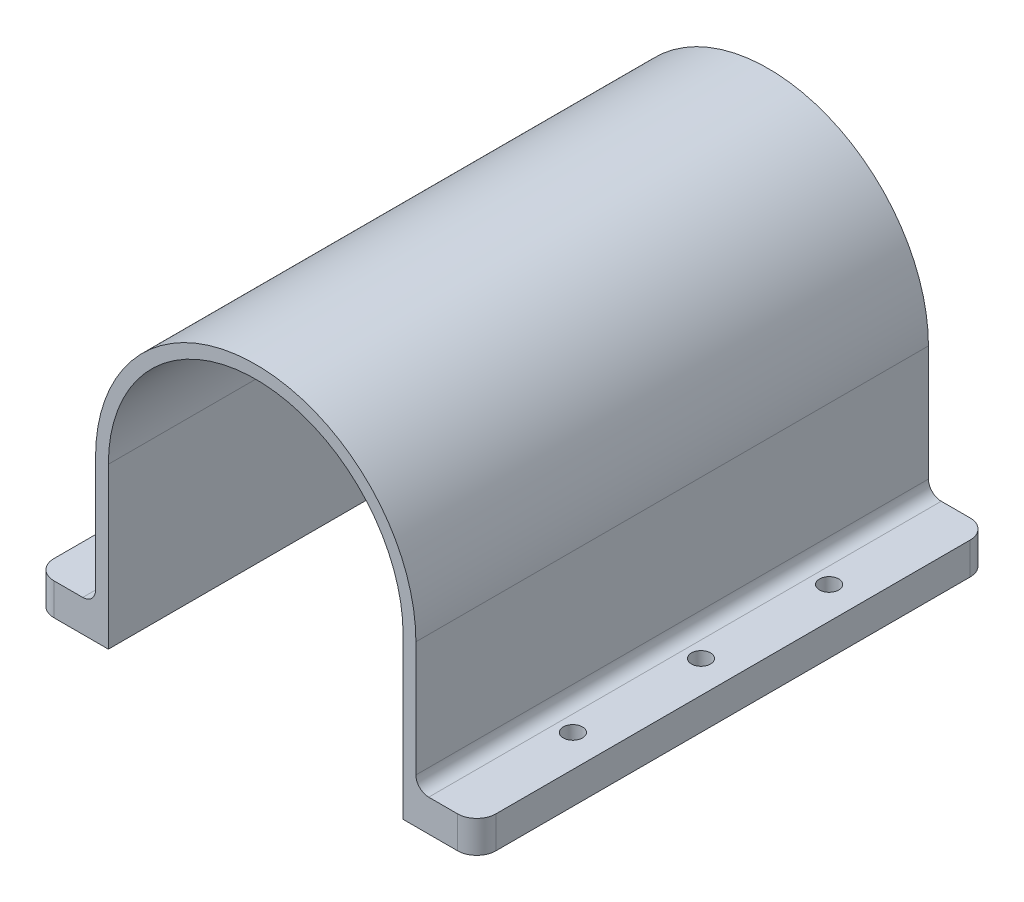
ISO-10303-21;
HEADER;
FILE_DESCRIPTION(('STEP AP214'),'2;1');
FILE_NAME('part.step','',(''),(''),'','','');
FILE_SCHEMA(('AUTOMOTIVE_DESIGN { 1 0 10303 214 1 1 1 1 }'));
ENDSEC;
DATA;
#1=APPLICATION_CONTEXT('core data for automotive mechanical design processes');
#2=APPLICATION_PROTOCOL_DEFINITION('international standard','automotive_design',2000,#1);
#3=PRODUCT_CONTEXT('',#1,'mechanical');
#4=PRODUCT('Part','Part','',(#3));
#5=PRODUCT_RELATED_PRODUCT_CATEGORY('part','',(#4));
#6=PRODUCT_DEFINITION_FORMATION('','',#4);
#7=PRODUCT_DEFINITION_CONTEXT('part definition',#1,'design');
#8=PRODUCT_DEFINITION('design','',#6,#7);
#9=PRODUCT_DEFINITION_SHAPE('','',#8);
#10=(LENGTH_UNIT() NAMED_UNIT(*) SI_UNIT(.MILLI.,.METRE.));
#11=(NAMED_UNIT(*) PLANE_ANGLE_UNIT() SI_UNIT($,.RADIAN.));
#12=(NAMED_UNIT(*) SI_UNIT($,.STERADIAN.) SOLID_ANGLE_UNIT());
#13=UNCERTAINTY_MEASURE_WITH_UNIT(LENGTH_MEASURE(1.E-05),#10,'distance_accuracy_value','');
#14=(GEOMETRIC_REPRESENTATION_CONTEXT(3) GLOBAL_UNCERTAINTY_ASSIGNED_CONTEXT((#13)) GLOBAL_UNIT_ASSIGNED_CONTEXT((#10,
#11,#12)) REPRESENTATION_CONTEXT('',''));
#15=CARTESIAN_POINT('',(0.,0.,0.));
#16=DIRECTION('',(0.,0.,1.));
#17=DIRECTION('',(1.,0.,0.));
#18=AXIS2_PLACEMENT_3D('',#15,#16,#17);
#19=CARTESIAN_POINT('',(-12.4097240098239,12.4097240098239,80.));
#20=DIRECTION('',(0.,0.,-1.));
#21=DIRECTION('',(-1.,0.,0.));
#22=AXIS2_PLACEMENT_3D('',#19,#20,#21);
#23=CYLINDRICAL_SURFACE('',#22,2.);
#24=CARTESIAN_POINT('',(-12.4097240098239,12.4097240098239,0.));
#25=DIRECTION('',(0.,0.,1.));
#26=DIRECTION('',(1.,0.,0.));
#27=AXIS2_PLACEMENT_3D('',#24,#25,#26);
#28=CIRCLE('',#27,2.);
#29=CARTESIAN_POINT('',(-10.4097240098239,12.4097240098239,0.));
#30=VERTEX_POINT('',#29);
#31=EDGE_CURVE('E231',#30,#30,#28,.T.);
#32=ORIENTED_EDGE('',*,*,#31,.F.);
#33=EDGE_LOOP('',(#32));
#34=FACE_BOUND('',#33,.T.);
#35=CARTESIAN_POINT('',(-12.4097240098239,12.4097240098239,5.));
#36=DIRECTION('',(0.,0.,1.));
#37=DIRECTION('',(1.,0.,0.));
#38=AXIS2_PLACEMENT_3D('',#35,#36,#37);
#39=CIRCLE('',#38,2.);
#40=CARTESIAN_POINT('',(-10.4097240098239,12.4097240098239,5.));
#41=VERTEX_POINT('',#40);
#42=EDGE_CURVE('E216',#41,#41,#39,.T.);
#43=ORIENTED_EDGE('',*,*,#42,.T.);
#44=EDGE_LOOP('',(#43));
#45=FACE_BOUND('',#44,.T.);
#46=ADVANCED_FACE('F39',(#34,#45),#23,.F.);
#47=CARTESIAN_POINT('',(0.,0.,80.));
#48=DIRECTION('',(0.,0.,-1.));
#49=DIRECTION('',(-1.,0.,0.));
#50=AXIS2_PLACEMENT_3D('',#47,#48,#49);
#51=CYLINDRICAL_SURFACE('',#50,13.);
#52=CARTESIAN_POINT('',(0.,0.,0.));
#53=DIRECTION('',(0.,0.,1.));
#54=DIRECTION('',(1.,0.,0.));
#55=AXIS2_PLACEMENT_3D('',#52,#53,#54);
#56=CIRCLE('',#55,13.);
#57=CARTESIAN_POINT('',(13.,0.,0.));
#58=VERTEX_POINT('',#57);
#59=EDGE_CURVE('E228',#58,#58,#56,.T.);
#60=ORIENTED_EDGE('',*,*,#59,.F.);
#61=EDGE_LOOP('',(#60));
#62=FACE_BOUND('',#61,.T.);
#63=CARTESIAN_POINT('',(0.,0.,5.));
#64=DIRECTION('',(0.,0.,1.));
#65=DIRECTION('',(1.,0.,0.));
#66=AXIS2_PLACEMENT_3D('',#63,#64,#65);
#67=CIRCLE('',#66,13.);
#68=CARTESIAN_POINT('',(13.,0.,5.));
#69=VERTEX_POINT('',#68);
#70=EDGE_CURVE('E213',#69,#69,#67,.T.);
#71=ORIENTED_EDGE('',*,*,#70,.T.);
#72=EDGE_LOOP('',(#71));
#73=FACE_BOUND('',#72,.T.);
#74=ADVANCED_FACE('F400',(#62,#73),#51,.F.);
#75=CARTESIAN_POINT('',(12.4097240098239,12.4097240098239,80.));
#76=DIRECTION('',(0.,0.,-1.));
#77=DIRECTION('',(-1.,0.,0.));
#78=AXIS2_PLACEMENT_3D('',#75,#76,#77);
#79=CYLINDRICAL_SURFACE('',#78,2.);
#80=CARTESIAN_POINT('',(12.4097240098239,12.4097240098239,0.));
#81=DIRECTION('',(0.,0.,1.));
#82=DIRECTION('',(1.,0.,0.));
#83=AXIS2_PLACEMENT_3D('',#80,#81,#82);
#84=CIRCLE('',#83,2.);
#85=CARTESIAN_POINT('',(14.4097240098239,12.4097240098239,0.));
#86=VERTEX_POINT('',#85);
#87=EDGE_CURVE('E225',#86,#86,#84,.T.);
#88=ORIENTED_EDGE('',*,*,#87,.F.);
#89=EDGE_LOOP('',(#88));
#90=FACE_BOUND('',#89,.T.);
#91=CARTESIAN_POINT('',(12.4097240098239,12.4097240098239,5.));
#92=DIRECTION('',(0.,0.,1.));
#93=DIRECTION('',(1.,0.,0.));
#94=AXIS2_PLACEMENT_3D('',#91,#92,#93);
#95=CIRCLE('',#94,2.);
#96=CARTESIAN_POINT('',(14.4097240098239,12.4097240098239,5.));
#97=VERTEX_POINT('',#96);
#98=EDGE_CURVE('E210',#97,#97,#95,.T.);
#99=ORIENTED_EDGE('',*,*,#98,.T.);
#100=EDGE_LOOP('',(#99));
#101=FACE_BOUND('',#100,.T.);
#102=ADVANCED_FACE('F407',(#90,#101),#79,.F.);
#103=CARTESIAN_POINT('',(12.4097240098239,-12.4097240098239,80.));
#104=DIRECTION('',(0.,0.,-1.));
#105=DIRECTION('',(-1.,0.,0.));
#106=AXIS2_PLACEMENT_3D('',#103,#104,#105);
#107=CYLINDRICAL_SURFACE('',#106,2.);
#108=CARTESIAN_POINT('',(12.4097240098239,-12.4097240098239,0.));
#109=DIRECTION('',(0.,0.,1.));
#110=DIRECTION('',(1.,0.,0.));
#111=AXIS2_PLACEMENT_3D('',#108,#109,#110);
#112=CIRCLE('',#111,2.);
#113=CARTESIAN_POINT('',(14.4097240098239,-12.4097240098239,0.));
#114=VERTEX_POINT('',#113);
#115=EDGE_CURVE('E222',#114,#114,#112,.T.);
#116=ORIENTED_EDGE('',*,*,#115,.F.);
#117=EDGE_LOOP('',(#116));
#118=FACE_BOUND('',#117,.T.);
#119=CARTESIAN_POINT('',(12.4097240098239,-12.4097240098239,5.));
#120=DIRECTION('',(0.,0.,1.));
#121=DIRECTION('',(1.,0.,0.));
#122=AXIS2_PLACEMENT_3D('',#119,#120,#121);
#123=CIRCLE('',#122,2.);
#124=CARTESIAN_POINT('',(14.4097240098239,-12.4097240098239,5.));
#125=VERTEX_POINT('',#124);
#126=EDGE_CURVE('E207',#125,#125,#123,.T.);
#127=ORIENTED_EDGE('',*,*,#126,.T.);
#128=EDGE_LOOP('',(#127));
#129=FACE_BOUND('',#128,.T.);
#130=ADVANCED_FACE('F592',(#118,#129),#107,.F.);
#131=CARTESIAN_POINT('',(-12.4097240098239,-12.4097240098239,80.));
#132=DIRECTION('',(0.,0.,-1.));
#133=DIRECTION('',(-1.,0.,0.));
#134=AXIS2_PLACEMENT_3D('',#131,#132,#133);
#135=CYLINDRICAL_SURFACE('',#134,2.);
#136=CARTESIAN_POINT('',(-12.4097240098239,-12.4097240098239,0.));
#137=DIRECTION('',(0.,0.,1.));
#138=DIRECTION('',(1.,0.,0.));
#139=AXIS2_PLACEMENT_3D('',#136,#137,#138);
#140=CIRCLE('',#139,2.);
#141=CARTESIAN_POINT('',(-10.4097240098239,-12.4097240098239,0.));
#142=VERTEX_POINT('',#141);
#143=EDGE_CURVE('E219',#142,#142,#140,.T.);
#144=ORIENTED_EDGE('',*,*,#143,.F.);
#145=EDGE_LOOP('',(#144));
#146=FACE_BOUND('',#145,.T.);
#147=CARTESIAN_POINT('',(-12.4097240098239,-12.4097240098239,5.));
#148=DIRECTION('',(0.,0.,1.));
#149=DIRECTION('',(1.,0.,0.));
#150=AXIS2_PLACEMENT_3D('',#147,#148,#149);
#151=CIRCLE('',#150,2.);
#152=CARTESIAN_POINT('',(-10.4097240098239,-12.4097240098239,5.));
#153=VERTEX_POINT('',#152);
#154=EDGE_CURVE('E203',#153,#153,#151,.T.);
#155=ORIENTED_EDGE('',*,*,#154,.T.);
#156=EDGE_LOOP('',(#155));
#157=FACE_BOUND('',#156,.T.);
#158=ADVANCED_FACE('F416',(#146,#157),#135,.F.);
#159=CARTESIAN_POINT('',(0.,0.,80.));
#160=DIRECTION('',(0.,0.,1.));
#161=DIRECTION('',(1.,0.,0.));
#162=AXIS2_PLACEMENT_3D('',#159,#160,#161);
#163=PLANE('',#162);
#164=DIRECTION('',(1.,0.,0.));
#165=VECTOR('',#164,1.);
#166=CARTESIAN_POINT('',(-34.5,-25.,80.));
#167=LINE('',#166,#165);
#168=CARTESIAN_POINT('',(23.,-25.,80.));
#169=VERTEX_POINT('',#168);
#170=CARTESIAN_POINT('',(31.5,-25.,80.));
#171=VERTEX_POINT('',#170);
#172=EDGE_CURVE('E245',#169,#171,#167,.T.);
#173=ORIENTED_EDGE('',*,*,#172,.T.);
#174=DIRECTION('',(0.,1.,0.));
#175=VECTOR('',#174,1.);
#176=CARTESIAN_POINT('',(31.5,-20.,80.));
#177=LINE('',#176,#175);
#178=CARTESIAN_POINT('',(31.5,-20.,80.));
#179=VERTEX_POINT('',#178);
#180=EDGE_CURVE('E318',#171,#179,#177,.T.);
#181=ORIENTED_EDGE('',*,*,#180,.T.);
#182=DIRECTION('',(-1.,0.,0.));
#183=VECTOR('',#182,1.);
#184=CARTESIAN_POINT('',(25.,-20.,80.));
#185=LINE('',#184,#183);
#186=CARTESIAN_POINT('',(27.,-20.,80.));
#187=VERTEX_POINT('',#186);
#188=EDGE_CURVE('E248',#179,#187,#185,.T.);
#189=ORIENTED_EDGE('',*,*,#188,.T.);
#190=CARTESIAN_POINT('',(27.,-18.,80.));
#191=DIRECTION('',(0.,0.,1.));
#192=DIRECTION('',(1.,0.,0.));
#193=AXIS2_PLACEMENT_3D('',#190,#191,#192);
#194=CIRCLE('',#193,2.);
#195=CARTESIAN_POINT('',(25.,-18.,80.));
#196=VERTEX_POINT('',#195);
#197=EDGE_CURVE('E309',#187,#196,#194,.F.);
#198=ORIENTED_EDGE('',*,*,#197,.T.);
#199=DIRECTION('',(0.,1.,0.));
#200=VECTOR('',#199,1.);
#201=CARTESIAN_POINT('',(25.,0.,80.));
#202=LINE('',#201,#200);
#203=CARTESIAN_POINT('',(25.,0.,80.));
#204=VERTEX_POINT('',#203);
#205=EDGE_CURVE('E250',#196,#204,#202,.T.);
#206=ORIENTED_EDGE('',*,*,#205,.T.);
#207=CARTESIAN_POINT('',(0.,0.,80.));
#208=DIRECTION('',(0.,0.,1.));
#209=DIRECTION('',(1.,0.,0.));
#210=AXIS2_PLACEMENT_3D('',#207,#208,#209);
#211=CIRCLE('',#210,25.);
#212=CARTESIAN_POINT('',(-25.,0.,80.));
#213=VERTEX_POINT('',#212);
#214=EDGE_CURVE('E235',#204,#213,#211,.T.);
#215=ORIENTED_EDGE('',*,*,#214,.T.);
#216=DIRECTION('',(0.,-1.,0.));
#217=VECTOR('',#216,1.);
#218=CARTESIAN_POINT('',(-25.,0.,80.));
#219=LINE('',#218,#217);
#220=CARTESIAN_POINT('',(-25.,-18.,80.));
#221=VERTEX_POINT('',#220);
#222=EDGE_CURVE('E238',#213,#221,#219,.T.);
#223=ORIENTED_EDGE('',*,*,#222,.T.);
#224=CARTESIAN_POINT('',(-27.,-18.,80.));
#225=DIRECTION('',(0.,0.,1.));
#226=DIRECTION('',(1.,0.,0.));
#227=AXIS2_PLACEMENT_3D('',#224,#225,#226);
#228=CIRCLE('',#227,2.);
#229=CARTESIAN_POINT('',(-27.,-20.,80.));
#230=VERTEX_POINT('',#229);
#231=EDGE_CURVE('E313',#221,#230,#228,.F.);
#232=ORIENTED_EDGE('',*,*,#231,.T.);
#233=DIRECTION('',(-1.,0.,0.));
#234=VECTOR('',#233,1.);
#235=CARTESIAN_POINT('',(-25.,-20.,80.));
#236=LINE('',#235,#234);
#237=CARTESIAN_POINT('',(-31.5,-20.,80.));
#238=VERTEX_POINT('',#237);
#239=EDGE_CURVE('E242',#230,#238,#236,.T.);
#240=ORIENTED_EDGE('',*,*,#239,.T.);
#241=DIRECTION('',(0.,-1.,0.));
#242=VECTOR('',#241,1.);
#243=CARTESIAN_POINT('',(-31.5,-25.,80.));
#244=LINE('',#243,#242);
#245=CARTESIAN_POINT('',(-31.5,-25.,80.));
#246=VERTEX_POINT('',#245);
#247=EDGE_CURVE('E315',#238,#246,#244,.T.);
#248=ORIENTED_EDGE('',*,*,#247,.T.);
#249=CARTESIAN_POINT('',(-23.,-25.,80.));
#250=VERTEX_POINT('',#249);
#251=EDGE_CURVE('E246',#246,#250,#167,.T.);
#252=ORIENTED_EDGE('',*,*,#251,.T.);
#253=DIRECTION('',(0.,-1.,0.));
#254=VECTOR('',#253,1.);
#255=CARTESIAN_POINT('',(-23.,0.,80.));
#256=LINE('',#255,#254);
#257=CARTESIAN_POINT('',(-23.,0.,80.));
#258=VERTEX_POINT('',#257);
#259=EDGE_CURVE('E191',#258,#250,#256,.T.);
#260=ORIENTED_EDGE('',*,*,#259,.F.);
#261=CARTESIAN_POINT('',(0.,0.,80.));
#262=DIRECTION('',(0.,0.,1.));
#263=DIRECTION('',(1.,0.,0.));
#264=AXIS2_PLACEMENT_3D('',#261,#262,#263);
#265=CIRCLE('',#264,23.);
#266=CARTESIAN_POINT('',(23.,0.,80.));
#267=VERTEX_POINT('',#266);
#268=EDGE_CURVE('E171',#267,#258,#265,.T.);
#269=ORIENTED_EDGE('',*,*,#268,.F.);
#270=DIRECTION('',(0.,1.,0.));
#271=VECTOR('',#270,1.);
#272=CARTESIAN_POINT('',(23.,0.,80.));
#273=LINE('',#272,#271);
#274=EDGE_CURVE('E188',#169,#267,#273,.T.);
#275=ORIENTED_EDGE('',*,*,#274,.F.);
#276=EDGE_LOOP('',(#173,#181,#189,#198,#206,#215,#223,#232,#240,#248,#252,#260,#269,#275));
#277=FACE_BOUND('',#276,.T.);
#278=ADVANCED_FACE('F353',(#277),#163,.T.);
#279=CARTESIAN_POINT('',(0.,0.,0.));
#280=DIRECTION('',(0.,0.,1.));
#281=DIRECTION('',(1.,0.,0.));
#282=AXIS2_PLACEMENT_3D('',#279,#280,#281);
#283=PLANE('',#282);
#284=DIRECTION('',(-1.,0.,0.));
#285=VECTOR('',#284,1.);
#286=CARTESIAN_POINT('',(25.,-20.,0.));
#287=LINE('',#286,#285);
#288=CARTESIAN_POINT('',(31.5,-20.,0.));
#289=VERTEX_POINT('',#288);
#290=CARTESIAN_POINT('',(27.,-20.,0.));
#291=VERTEX_POINT('',#290);
#292=EDGE_CURVE('E263',#289,#291,#287,.T.);
#293=ORIENTED_EDGE('',*,*,#292,.F.);
#294=DIRECTION('',(0.,1.,0.));
#295=VECTOR('',#294,1.);
#296=CARTESIAN_POINT('',(31.5,0.,0.));
#297=LINE('',#296,#295);
#298=CARTESIAN_POINT('',(31.5,-25.,0.));
#299=VERTEX_POINT('',#298);
#300=EDGE_CURVE('E340',#289,#299,#297,.F.);
#301=ORIENTED_EDGE('',*,*,#300,.T.);
#302=DIRECTION('',(1.,0.,0.));
#303=VECTOR('',#302,1.);
#304=CARTESIAN_POINT('',(-34.5,-25.,0.));
#305=LINE('',#304,#303);
#306=CARTESIAN_POINT('',(-31.5,-25.,0.));
#307=VERTEX_POINT('',#306);
#308=EDGE_CURVE('E260',#307,#299,#305,.T.);
#309=ORIENTED_EDGE('',*,*,#308,.F.);
#310=DIRECTION('',(0.,-1.,0.));
#311=VECTOR('',#310,1.);
#312=CARTESIAN_POINT('',(-31.5,0.,0.));
#313=LINE('',#312,#311);
#314=CARTESIAN_POINT('',(-31.5,-20.,0.));
#315=VERTEX_POINT('',#314);
#316=EDGE_CURVE('E338',#307,#315,#313,.F.);
#317=ORIENTED_EDGE('',*,*,#316,.T.);
#318=DIRECTION('',(-1.,0.,0.));
#319=VECTOR('',#318,1.);
#320=CARTESIAN_POINT('',(-25.,-20.,0.));
#321=LINE('',#320,#319);
#322=CARTESIAN_POINT('',(-27.,-20.,0.));
#323=VERTEX_POINT('',#322);
#324=EDGE_CURVE('E258',#323,#315,#321,.T.);
#325=ORIENTED_EDGE('',*,*,#324,.F.);
#326=CARTESIAN_POINT('',(-27.,-18.,0.));
#327=DIRECTION('',(0.,0.,1.));
#328=DIRECTION('',(1.,0.,0.));
#329=AXIS2_PLACEMENT_3D('',#326,#327,#328);
#330=CIRCLE('',#329,2.);
#331=CARTESIAN_POINT('',(-25.,-18.,0.));
#332=VERTEX_POINT('',#331);
#333=EDGE_CURVE('E311',#323,#332,#330,.T.);
#334=ORIENTED_EDGE('',*,*,#333,.T.);
#335=DIRECTION('',(0.,-1.,0.));
#336=VECTOR('',#335,1.);
#337=CARTESIAN_POINT('',(-25.,0.,0.));
#338=LINE('',#337,#336);
#339=CARTESIAN_POINT('',(-25.,0.,0.));
#340=VERTEX_POINT('',#339);
#341=EDGE_CURVE('E255',#340,#332,#338,.T.);
#342=ORIENTED_EDGE('',*,*,#341,.F.);
#343=CARTESIAN_POINT('',(0.,0.,0.));
#344=DIRECTION('',(0.,0.,1.));
#345=DIRECTION('',(1.,0.,0.));
#346=AXIS2_PLACEMENT_3D('',#343,#344,#345);
#347=CIRCLE('',#346,25.);
#348=CARTESIAN_POINT('',(25.,0.,0.));
#349=VERTEX_POINT('',#348);
#350=EDGE_CURVE('E234',#349,#340,#347,.T.);
#351=ORIENTED_EDGE('',*,*,#350,.F.);
#352=DIRECTION('',(0.,1.,0.));
#353=VECTOR('',#352,1.);
#354=CARTESIAN_POINT('',(25.,0.,0.));
#355=LINE('',#354,#353);
#356=CARTESIAN_POINT('',(25.,-18.,0.));
#357=VERTEX_POINT('',#356);
#358=EDGE_CURVE('E239',#357,#349,#355,.T.);
#359=ORIENTED_EDGE('',*,*,#358,.F.);
#360=CARTESIAN_POINT('',(27.,-18.,0.));
#361=DIRECTION('',(0.,0.,1.));
#362=DIRECTION('',(1.,0.,0.));
#363=AXIS2_PLACEMENT_3D('',#360,#361,#362);
#364=CIRCLE('',#363,2.);
#365=EDGE_CURVE('E306',#357,#291,#364,.T.);
#366=ORIENTED_EDGE('',*,*,#365,.T.);
#367=EDGE_LOOP('',(#293,#301,#309,#317,#325,#334,#342,#351,#359,#366));
#368=FACE_BOUND('',#367,.T.);
#369=ORIENTED_EDGE('',*,*,#31,.T.);
#370=EDGE_LOOP('',(#369));
#371=FACE_BOUND('',#370,.T.);
#372=ORIENTED_EDGE('',*,*,#59,.T.);
#373=EDGE_LOOP('',(#372));
#374=FACE_BOUND('',#373,.T.);
#375=ORIENTED_EDGE('',*,*,#87,.T.);
#376=EDGE_LOOP('',(#375));
#377=FACE_BOUND('',#376,.T.);
#378=ORIENTED_EDGE('',*,*,#115,.T.);
#379=EDGE_LOOP('',(#378));
#380=FACE_BOUND('',#379,.T.);
#381=ORIENTED_EDGE('',*,*,#143,.T.);
#382=EDGE_LOOP('',(#381));
#383=FACE_BOUND('',#382,.T.);
#384=ADVANCED_FACE('F368',(#368,#371,#374,#377,#380,#383),#283,.F.);
#385=CARTESIAN_POINT('',(0.,0.,80.));
#386=DIRECTION('',(0.,0.,-1.));
#387=DIRECTION('',(-1.,0.,0.));
#388=AXIS2_PLACEMENT_3D('',#385,#386,#387);
#389=CYLINDRICAL_SURFACE('',#388,25.);
#390=ORIENTED_EDGE('',*,*,#350,.T.);
#391=DIRECTION('',(0.,0.,-1.));
#392=VECTOR('',#391,1.);
#393=CARTESIAN_POINT('',(-25.,0.,80.));
#394=LINE('',#393,#392);
#395=EDGE_CURVE('E279',#213,#340,#394,.T.);
#396=ORIENTED_EDGE('',*,*,#395,.F.);
#397=ORIENTED_EDGE('',*,*,#214,.F.);
#398=DIRECTION('',(0.,0.,-1.));
#399=VECTOR('',#398,1.);
#400=CARTESIAN_POINT('',(25.,0.,80.));
#401=LINE('',#400,#399);
#402=EDGE_CURVE('E252',#204,#349,#401,.T.);
#403=ORIENTED_EDGE('',*,*,#402,.T.);
#404=EDGE_LOOP('',(#390,#396,#397,#403));
#405=FACE_BOUND('',#404,.T.);
#406=ADVANCED_FACE('F419',(#405),#389,.T.);
#407=CARTESIAN_POINT('',(-25.,0.,80.));
#408=DIRECTION('',(1.,0.,0.));
#409=DIRECTION('',(0.,1.,0.));
#410=AXIS2_PLACEMENT_3D('',#407,#408,#409);
#411=PLANE('',#410);
#412=ORIENTED_EDGE('',*,*,#341,.T.);
#413=DIRECTION('',(0.,0.,-1.));
#414=VECTOR('',#413,1.);
#415=CARTESIAN_POINT('',(-25.,-18.,80.));
#416=LINE('',#415,#414);
#417=EDGE_CURVE('E304',#332,#221,#416,.F.);
#418=ORIENTED_EDGE('',*,*,#417,.T.);
#419=ORIENTED_EDGE('',*,*,#222,.F.);
#420=ORIENTED_EDGE('',*,*,#395,.T.);
#421=EDGE_LOOP('',(#412,#418,#419,#420));
#422=FACE_BOUND('',#421,.T.);
#423=ADVANCED_FACE('F436',(#422),#411,.F.);
#424=CARTESIAN_POINT('',(-25.,-20.,80.));
#425=DIRECTION('',(0.,-1.,0.));
#426=DIRECTION('',(0.,0.,-1.));
#427=AXIS2_PLACEMENT_3D('',#424,#425,#426);
#428=PLANE('',#427);
#429=CARTESIAN_POINT('',(-29.5,-20.,60.));
#430=DIRECTION('',(0.,-1.,0.));
#431=DIRECTION('',(0.,0.,-1.));
#432=AXIS2_PLACEMENT_3D('',#429,#430,#431);
#433=CIRCLE('',#432,1.5);
#434=CARTESIAN_POINT('',(-29.5,-20.,58.5));
#435=VERTEX_POINT('',#434);
#436=EDGE_CURVE('E194',#435,#435,#433,.T.);
#437=ORIENTED_EDGE('',*,*,#436,.T.);
#438=EDGE_LOOP('',(#437));
#439=FACE_BOUND('',#438,.T.);
#440=CARTESIAN_POINT('',(-29.5,-20.,40.));
#441=DIRECTION('',(0.,-1.,0.));
#442=DIRECTION('',(0.,0.,-1.));
#443=AXIS2_PLACEMENT_3D('',#440,#441,#442);
#444=CIRCLE('',#443,1.5);
#445=CARTESIAN_POINT('',(-29.5,-20.,38.5));
#446=VERTEX_POINT('',#445);
#447=EDGE_CURVE('E719',#446,#446,#444,.T.);
#448=ORIENTED_EDGE('',*,*,#447,.T.);
#449=EDGE_LOOP('',(#448));
#450=FACE_BOUND('',#449,.T.);
#451=CARTESIAN_POINT('',(-29.5,-20.,20.));
#452=DIRECTION('',(0.,-1.,0.));
#453=DIRECTION('',(0.,0.,-1.));
#454=AXIS2_PLACEMENT_3D('',#451,#452,#453);
#455=CIRCLE('',#454,1.5);
#456=CARTESIAN_POINT('',(-29.5,-20.,18.5));
#457=VERTEX_POINT('',#456);
#458=EDGE_CURVE('E295',#457,#457,#455,.T.);
#459=ORIENTED_EDGE('',*,*,#458,.T.);
#460=EDGE_LOOP('',(#459));
#461=FACE_BOUND('',#460,.T.);
#462=ORIENTED_EDGE('',*,*,#324,.T.);
#463=CARTESIAN_POINT('',(-31.5,-20.,3.));
#464=DIRECTION('',(0.,-1.,0.));
#465=DIRECTION('',(0.,0.,-1.));
#466=AXIS2_PLACEMENT_3D('',#463,#464,#465);
#467=CIRCLE('',#466,3.);
#468=CARTESIAN_POINT('',(-34.5,-20.,3.));
#469=VERTEX_POINT('',#468);
#470=EDGE_CURVE('E11',#315,#469,#467,.F.);
#471=ORIENTED_EDGE('',*,*,#470,.T.);
#472=DIRECTION('',(0.,0.,-1.));
#473=VECTOR('',#472,1.);
#474=CARTESIAN_POINT('',(-34.5,-20.,80.));
#475=LINE('',#474,#473);
#476=CARTESIAN_POINT('',(-34.5,-20.,77.));
#477=VERTEX_POINT('',#476);
#478=EDGE_CURVE('E277',#477,#469,#475,.T.);
#479=ORIENTED_EDGE('',*,*,#478,.F.);
#480=CARTESIAN_POINT('',(-31.5,-20.,77.));
#481=DIRECTION('',(0.,-1.,0.));
#482=DIRECTION('',(0.,0.,-1.));
#483=AXIS2_PLACEMENT_3D('',#480,#481,#482);
#484=CIRCLE('',#483,3.);
#485=EDGE_CURVE('E47',#477,#238,#484,.F.);
#486=ORIENTED_EDGE('',*,*,#485,.T.);
#487=ORIENTED_EDGE('',*,*,#239,.F.);
#488=DIRECTION('',(0.,0.,-1.));
#489=VECTOR('',#488,1.);
#490=CARTESIAN_POINT('',(-27.,-20.,0.));
#491=LINE('',#490,#489);
#492=EDGE_CURVE('E301',#230,#323,#491,.T.);
#493=ORIENTED_EDGE('',*,*,#492,.T.);
#494=EDGE_LOOP('',(#462,#471,#479,#486,#487,#493));
#495=FACE_BOUND('',#494,.T.);
#496=ADVANCED_FACE('F347',(#439,#450,#461,#495),#428,.F.);
#497=CARTESIAN_POINT('',(-34.5,-20.,80.));
#498=DIRECTION('',(1.,0.,0.));
#499=DIRECTION('',(0.,0.,-1.));
#500=AXIS2_PLACEMENT_3D('',#497,#498,#499);
#501=PLANE('',#500);
#502=ORIENTED_EDGE('',*,*,#478,.T.);
#503=DIRECTION('',(0.,-1.,0.));
#504=VECTOR('',#503,1.);
#505=CARTESIAN_POINT('',(-34.5,-20.,3.));
#506=LINE('',#505,#504);
#507=CARTESIAN_POINT('',(-34.5,-25.,3.));
#508=VERTEX_POINT('',#507);
#509=EDGE_CURVE('E343',#469,#508,#506,.T.);
#510=ORIENTED_EDGE('',*,*,#509,.T.);
#511=DIRECTION('',(0.,0.,-1.));
#512=VECTOR('',#511,1.);
#513=CARTESIAN_POINT('',(-34.5,-25.,80.));
#514=LINE('',#513,#512);
#515=CARTESIAN_POINT('',(-34.5,-25.,77.));
#516=VERTEX_POINT('',#515);
#517=EDGE_CURVE('E274',#516,#508,#514,.T.);
#518=ORIENTED_EDGE('',*,*,#517,.F.);
#519=DIRECTION('',(0.,-1.,0.));
#520=VECTOR('',#519,1.);
#521=CARTESIAN_POINT('',(-34.5,-20.,77.));
#522=LINE('',#521,#520);
#523=EDGE_CURVE('E59',#516,#477,#522,.F.);
#524=ORIENTED_EDGE('',*,*,#523,.T.);
#525=EDGE_LOOP('',(#502,#510,#518,#524));
#526=FACE_BOUND('',#525,.T.);
#527=ADVANCED_FACE('F359',(#526),#501,.F.);
#528=CARTESIAN_POINT('',(-34.5,-25.,80.));
#529=DIRECTION('',(0.,1.,0.));
#530=DIRECTION('',(-1.,0.,0.));
#531=AXIS2_PLACEMENT_3D('',#528,#529,#530);
#532=PLANE('',#531);
#533=CARTESIAN_POINT('',(29.5,-25.,60.));
#534=DIRECTION('',(0.,1.,0.));
#535=DIRECTION('',(0.,0.,1.));
#536=AXIS2_PLACEMENT_3D('',#533,#534,#535);
#537=CIRCLE('',#536,1.5);
#538=CARTESIAN_POINT('',(29.5,-25.,61.5));
#539=VERTEX_POINT('',#538);
#540=EDGE_CURVE('E709',#539,#539,#537,.T.);
#541=ORIENTED_EDGE('',*,*,#540,.T.);
#542=EDGE_LOOP('',(#541));
#543=FACE_BOUND('',#542,.T.);
#544=CARTESIAN_POINT('',(29.5,-25.,20.));
#545=DIRECTION('',(0.,1.,0.));
#546=DIRECTION('',(0.,0.,1.));
#547=AXIS2_PLACEMENT_3D('',#544,#545,#546);
#548=CIRCLE('',#547,1.5);
#549=CARTESIAN_POINT('',(29.5,-25.,21.5));
#550=VERTEX_POINT('',#549);
#551=EDGE_CURVE('E712',#550,#550,#548,.T.);
#552=ORIENTED_EDGE('',*,*,#551,.T.);
#553=EDGE_LOOP('',(#552));
#554=FACE_BOUND('',#553,.T.);
#555=CARTESIAN_POINT('',(-29.5,-25.,60.));
#556=DIRECTION('',(0.,1.,0.));
#557=DIRECTION('',(0.,0.,-1.));
#558=AXIS2_PLACEMENT_3D('',#555,#556,#557);
#559=CIRCLE('',#558,1.5);
#560=CARTESIAN_POINT('',(-29.5,-25.,58.5));
#561=VERTEX_POINT('',#560);
#562=EDGE_CURVE('E731',#561,#561,#559,.T.);
#563=ORIENTED_EDGE('',*,*,#562,.T.);
#564=EDGE_LOOP('',(#563));
#565=FACE_BOUND('',#564,.T.);
#566=CARTESIAN_POINT('',(-29.5,-25.,40.));
#567=DIRECTION('',(0.,1.,0.));
#568=DIRECTION('',(0.,0.,-1.));
#569=AXIS2_PLACEMENT_3D('',#566,#567,#568);
#570=CIRCLE('',#569,1.5);
#571=CARTESIAN_POINT('',(-29.5,-25.,38.5));
#572=VERTEX_POINT('',#571);
#573=EDGE_CURVE('E716',#572,#572,#570,.T.);
#574=ORIENTED_EDGE('',*,*,#573,.T.);
#575=EDGE_LOOP('',(#574));
#576=FACE_BOUND('',#575,.T.);
#577=CARTESIAN_POINT('',(-29.5,-25.,20.));
#578=DIRECTION('',(0.,1.,0.));
#579=DIRECTION('',(0.,0.,-1.));
#580=AXIS2_PLACEMENT_3D('',#577,#578,#579);
#581=CIRCLE('',#580,1.5);
#582=CARTESIAN_POINT('',(-29.5,-25.,18.5));
#583=VERTEX_POINT('',#582);
#584=EDGE_CURVE('E732',#583,#583,#581,.T.);
#585=ORIENTED_EDGE('',*,*,#584,.T.);
#586=EDGE_LOOP('',(#585));
#587=FACE_BOUND('',#586,.T.);
#588=CARTESIAN_POINT('',(29.5,-25.,40.));
#589=DIRECTION('',(0.,1.,0.));
#590=DIRECTION('',(0.,0.,1.));
#591=AXIS2_PLACEMENT_3D('',#588,#589,#590);
#592=CIRCLE('',#591,1.5);
#593=CARTESIAN_POINT('',(29.5,-25.,41.5));
#594=VERTEX_POINT('',#593);
#595=EDGE_CURVE('E289',#594,#594,#592,.T.);
#596=ORIENTED_EDGE('',*,*,#595,.T.);
#597=EDGE_LOOP('',(#596));
#598=FACE_BOUND('',#597,.T.);
#599=DIRECTION('',(0.,0.,-1.));
#600=VECTOR('',#599,1.);
#601=CARTESIAN_POINT('',(34.5,-25.,80.));
#602=LINE('',#601,#600);
#603=CARTESIAN_POINT('',(34.5,-25.,77.));
#604=VERTEX_POINT('',#603);
#605=CARTESIAN_POINT('',(34.5,-25.,3.));
#606=VERTEX_POINT('',#605);
#607=EDGE_CURVE('E271',#604,#606,#602,.T.);
#608=ORIENTED_EDGE('',*,*,#607,.F.);
#609=CARTESIAN_POINT('',(31.5,-25.,77.));
#610=DIRECTION('',(0.,1.,0.));
#611=DIRECTION('',(-1.,0.,0.));
#612=AXIS2_PLACEMENT_3D('',#609,#610,#611);
#613=CIRCLE('',#612,3.);
#614=EDGE_CURVE('E336',#604,#171,#613,.F.);
#615=ORIENTED_EDGE('',*,*,#614,.T.);
#616=ORIENTED_EDGE('',*,*,#172,.F.);
#617=DIRECTION('',(0.,0.,1.));
#618=VECTOR('',#617,1.);
#619=CARTESIAN_POINT('',(23.,-25.,5.));
#620=LINE('',#619,#618);
#621=CARTESIAN_POINT('',(23.,-25.,5.));
#622=VERTEX_POINT('',#621);
#623=EDGE_CURVE('E204',#622,#169,#620,.T.);
#624=ORIENTED_EDGE('',*,*,#623,.F.);
#625=DIRECTION('',(1.,0.,0.));
#626=VECTOR('',#625,1.);
#627=CARTESIAN_POINT('',(23.,-25.,5.));
#628=LINE('',#627,#626);
#629=CARTESIAN_POINT('',(-23.,-25.,5.));
#630=VERTEX_POINT('',#629);
#631=EDGE_CURVE('E184',#630,#622,#628,.T.);
#632=ORIENTED_EDGE('',*,*,#631,.F.);
#633=DIRECTION('',(0.,0.,1.));
#634=VECTOR('',#633,1.);
#635=CARTESIAN_POINT('',(-23.,-25.,5.));
#636=LINE('',#635,#634);
#637=EDGE_CURVE('E175',#630,#250,#636,.T.);
#638=ORIENTED_EDGE('',*,*,#637,.T.);
#639=ORIENTED_EDGE('',*,*,#251,.F.);
#640=CARTESIAN_POINT('',(-31.5,-25.,77.));
#641=DIRECTION('',(0.,1.,0.));
#642=DIRECTION('',(-1.,0.,0.));
#643=AXIS2_PLACEMENT_3D('',#640,#641,#642);
#644=CIRCLE('',#643,3.);
#645=EDGE_CURVE('E330',#246,#516,#644,.F.);
#646=ORIENTED_EDGE('',*,*,#645,.T.);
#647=ORIENTED_EDGE('',*,*,#517,.T.);
#648=CARTESIAN_POINT('',(-31.5,-25.,3.));
#649=DIRECTION('',(0.,1.,0.));
#650=DIRECTION('',(-1.,0.,0.));
#651=AXIS2_PLACEMENT_3D('',#648,#649,#650);
#652=CIRCLE('',#651,3.);
#653=EDGE_CURVE('E332',#508,#307,#652,.F.);
#654=ORIENTED_EDGE('',*,*,#653,.T.);
#655=ORIENTED_EDGE('',*,*,#308,.T.);
#656=CARTESIAN_POINT('',(31.5,-25.,3.));
#657=DIRECTION('',(0.,1.,0.));
#658=DIRECTION('',(-1.,0.,0.));
#659=AXIS2_PLACEMENT_3D('',#656,#657,#658);
#660=CIRCLE('',#659,3.);
#661=EDGE_CURVE('E334',#299,#606,#660,.F.);
#662=ORIENTED_EDGE('',*,*,#661,.T.);
#663=EDGE_LOOP('',(#608,#615,#616,#624,#632,#638,#639,#646,#647,#654,#655,#662));
#664=FACE_BOUND('',#663,.T.);
#665=ADVANCED_FACE('F358',(#543,#554,#565,#576,#587,#598,#664),#532,.F.);
#666=CARTESIAN_POINT('',(34.5,-20.,80.));
#667=DIRECTION('',(-1.,0.,0.));
#668=DIRECTION('',(0.,0.,1.));
#669=AXIS2_PLACEMENT_3D('',#666,#667,#668);
#670=PLANE('',#669);
#671=DIRECTION('',(0.,0.,-1.));
#672=VECTOR('',#671,1.);
#673=CARTESIAN_POINT('',(34.5,-20.,80.));
#674=LINE('',#673,#672);
#675=CARTESIAN_POINT('',(34.5,-20.,77.));
#676=VERTEX_POINT('',#675);
#677=CARTESIAN_POINT('',(34.5,-20.,3.));
#678=VERTEX_POINT('',#677);
#679=EDGE_CURVE('E268',#676,#678,#674,.T.);
#680=ORIENTED_EDGE('',*,*,#679,.F.);
#681=DIRECTION('',(0.,1.,0.));
#682=VECTOR('',#681,1.);
#683=CARTESIAN_POINT('',(34.5,-25.,77.));
#684=LINE('',#683,#682);
#685=EDGE_CURVE('E328',#676,#604,#684,.F.);
#686=ORIENTED_EDGE('',*,*,#685,.T.);
#687=ORIENTED_EDGE('',*,*,#607,.T.);
#688=DIRECTION('',(0.,1.,0.));
#689=VECTOR('',#688,1.);
#690=CARTESIAN_POINT('',(34.5,-20.,3.));
#691=LINE('',#690,#689);
#692=EDGE_CURVE('E325',#606,#678,#691,.T.);
#693=ORIENTED_EDGE('',*,*,#692,.T.);
#694=EDGE_LOOP('',(#680,#686,#687,#693));
#695=FACE_BOUND('',#694,.T.);
#696=ADVANCED_FACE('F378',(#695),#670,.F.);
#697=CARTESIAN_POINT('',(25.,-20.,80.));
#698=DIRECTION('',(0.,-1.,0.));
#699=DIRECTION('',(0.,0.,-1.));
#700=AXIS2_PLACEMENT_3D('',#697,#698,#699);
#701=PLANE('',#700);
#702=CARTESIAN_POINT('',(29.5,-20.,60.));
#703=DIRECTION('',(0.,-1.,0.));
#704=DIRECTION('',(0.,0.,-1.));
#705=AXIS2_PLACEMENT_3D('',#702,#703,#704);
#706=CIRCLE('',#705,1.5);
#707=CARTESIAN_POINT('',(29.5,-20.,58.5));
#708=VERTEX_POINT('',#707);
#709=EDGE_CURVE('E292',#708,#708,#706,.T.);
#710=ORIENTED_EDGE('',*,*,#709,.T.);
#711=EDGE_LOOP('',(#710));
#712=FACE_BOUND('',#711,.T.);
#713=CARTESIAN_POINT('',(29.5,-20.,20.));
#714=DIRECTION('',(0.,-1.,0.));
#715=DIRECTION('',(0.,0.,-1.));
#716=AXIS2_PLACEMENT_3D('',#713,#714,#715);
#717=CIRCLE('',#716,1.5);
#718=CARTESIAN_POINT('',(29.5,-20.,18.5));
#719=VERTEX_POINT('',#718);
#720=EDGE_CURVE('E288',#719,#719,#717,.T.);
#721=ORIENTED_EDGE('',*,*,#720,.T.);
#722=EDGE_LOOP('',(#721));
#723=FACE_BOUND('',#722,.T.);
#724=CARTESIAN_POINT('',(29.5,-20.,40.));
#725=DIRECTION('',(0.,-1.,0.));
#726=DIRECTION('',(0.,0.,-1.));
#727=AXIS2_PLACEMENT_3D('',#724,#725,#726);
#728=CIRCLE('',#727,1.5);
#729=CARTESIAN_POINT('',(29.5,-20.,38.5));
#730=VERTEX_POINT('',#729);
#731=EDGE_CURVE('E285',#730,#730,#728,.T.);
#732=ORIENTED_EDGE('',*,*,#731,.T.);
#733=EDGE_LOOP('',(#732));
#734=FACE_BOUND('',#733,.T.);
#735=ORIENTED_EDGE('',*,*,#188,.F.);
#736=CARTESIAN_POINT('',(31.5,-20.,77.));
#737=DIRECTION('',(0.,-1.,0.));
#738=DIRECTION('',(0.,0.,-1.));
#739=AXIS2_PLACEMENT_3D('',#736,#737,#738);
#740=CIRCLE('',#739,3.);
#741=EDGE_CURVE('E323',#179,#676,#740,.F.);
#742=ORIENTED_EDGE('',*,*,#741,.T.);
#743=ORIENTED_EDGE('',*,*,#679,.T.);
#744=CARTESIAN_POINT('',(31.5,-20.,3.));
#745=DIRECTION('',(0.,-1.,0.));
#746=DIRECTION('',(0.,0.,-1.));
#747=AXIS2_PLACEMENT_3D('',#744,#745,#746);
#748=CIRCLE('',#747,3.);
#749=EDGE_CURVE('E321',#678,#289,#748,.F.);
#750=ORIENTED_EDGE('',*,*,#749,.T.);
#751=ORIENTED_EDGE('',*,*,#292,.T.);
#752=DIRECTION('',(0.,0.,-1.));
#753=VECTOR('',#752,1.);
#754=CARTESIAN_POINT('',(27.,-20.,80.));
#755=LINE('',#754,#753);
#756=EDGE_CURVE('E298',#291,#187,#755,.F.);
#757=ORIENTED_EDGE('',*,*,#756,.T.);
#758=EDGE_LOOP('',(#735,#742,#743,#750,#751,#757));
#759=FACE_BOUND('',#758,.T.);
#760=ADVANCED_FACE('F422',(#712,#723,#734,#759),#701,.F.);
#761=CARTESIAN_POINT('',(25.,0.,80.));
#762=DIRECTION('',(-1.,0.,0.));
#763=DIRECTION('',(0.,-1.,0.));
#764=AXIS2_PLACEMENT_3D('',#761,#762,#763);
#765=PLANE('',#764);
#766=ORIENTED_EDGE('',*,*,#205,.F.);
#767=DIRECTION('',(0.,0.,-1.));
#768=VECTOR('',#767,1.);
#769=CARTESIAN_POINT('',(25.,-18.,0.));
#770=LINE('',#769,#768);
#771=EDGE_CURVE('E282',#196,#357,#770,.T.);
#772=ORIENTED_EDGE('',*,*,#771,.T.);
#773=ORIENTED_EDGE('',*,*,#358,.T.);
#774=ORIENTED_EDGE('',*,*,#402,.F.);
#775=EDGE_LOOP('',(#766,#772,#773,#774));
#776=FACE_BOUND('',#775,.T.);
#777=ADVANCED_FACE('F396',(#776),#765,.F.);
#778=CARTESIAN_POINT('',(0.,0.,5.));
#779=DIRECTION('',(0.,0.,1.));
#780=DIRECTION('',(1.,0.,0.));
#781=AXIS2_PLACEMENT_3D('',#778,#779,#780);
#782=CYLINDRICAL_SURFACE('',#781,23.);
#783=ORIENTED_EDGE('',*,*,#268,.T.);
#784=DIRECTION('',(0.,0.,1.));
#785=VECTOR('',#784,1.);
#786=CARTESIAN_POINT('',(-23.,0.,5.));
#787=LINE('',#786,#785);
#788=CARTESIAN_POINT('',(-23.,0.,5.));
#789=VERTEX_POINT('',#788);
#790=EDGE_CURVE('E164',#789,#258,#787,.T.);
#791=ORIENTED_EDGE('',*,*,#790,.F.);
#792=CARTESIAN_POINT('',(0.,0.,5.));
#793=DIRECTION('',(0.,0.,1.));
#794=DIRECTION('',(1.,0.,0.));
#795=AXIS2_PLACEMENT_3D('',#792,#793,#794);
#796=CIRCLE('',#795,23.);
#797=CARTESIAN_POINT('',(23.,0.,5.));
#798=VERTEX_POINT('',#797);
#799=EDGE_CURVE('E168',#798,#789,#796,.T.);
#800=ORIENTED_EDGE('',*,*,#799,.F.);
#801=DIRECTION('',(0.,0.,1.));
#802=VECTOR('',#801,1.);
#803=CARTESIAN_POINT('',(23.,0.,5.));
#804=LINE('',#803,#802);
#805=EDGE_CURVE('E201',#798,#267,#804,.T.);
#806=ORIENTED_EDGE('',*,*,#805,.T.);
#807=EDGE_LOOP('',(#783,#791,#800,#806));
#808=FACE_BOUND('',#807,.T.);
#809=ADVANCED_FACE('F166',(#808),#782,.F.);
#810=CARTESIAN_POINT('',(23.,0.,5.));
#811=DIRECTION('',(1.,0.,0.));
#812=DIRECTION('',(0.,0.,-1.));
#813=AXIS2_PLACEMENT_3D('',#810,#811,#812);
#814=PLANE('',#813);
#815=ORIENTED_EDGE('',*,*,#274,.T.);
#816=ORIENTED_EDGE('',*,*,#805,.F.);
#817=DIRECTION('',(0.,1.,0.));
#818=VECTOR('',#817,1.);
#819=CARTESIAN_POINT('',(23.,0.,5.));
#820=LINE('',#819,#818);
#821=EDGE_CURVE('E176',#622,#798,#820,.T.);
#822=ORIENTED_EDGE('',*,*,#821,.F.);
#823=ORIENTED_EDGE('',*,*,#623,.T.);
#824=EDGE_LOOP('',(#815,#816,#822,#823));
#825=FACE_BOUND('',#824,.T.);
#826=ADVANCED_FACE('F388',(#825),#814,.F.);
#827=CARTESIAN_POINT('',(-23.,0.,5.));
#828=DIRECTION('',(-1.,0.,0.));
#829=DIRECTION('',(0.,0.,1.));
#830=AXIS2_PLACEMENT_3D('',#827,#828,#829);
#831=PLANE('',#830);
#832=ORIENTED_EDGE('',*,*,#259,.T.);
#833=ORIENTED_EDGE('',*,*,#637,.F.);
#834=DIRECTION('',(0.,-1.,0.));
#835=VECTOR('',#834,1.);
#836=CARTESIAN_POINT('',(-23.,0.,5.));
#837=LINE('',#836,#835);
#838=EDGE_CURVE('E179',#789,#630,#837,.T.);
#839=ORIENTED_EDGE('',*,*,#838,.F.);
#840=ORIENTED_EDGE('',*,*,#790,.T.);
#841=EDGE_LOOP('',(#832,#833,#839,#840));
#842=FACE_BOUND('',#841,.T.);
#843=ADVANCED_FACE('F180',(#842),#831,.F.);
#844=CARTESIAN_POINT('',(0.,0.,5.));
#845=DIRECTION('',(0.,0.,1.));
#846=DIRECTION('',(1.,0.,0.));
#847=AXIS2_PLACEMENT_3D('',#844,#845,#846);
#848=PLANE('',#847);
#849=ORIENTED_EDGE('',*,*,#42,.F.);
#850=EDGE_LOOP('',(#849));
#851=FACE_BOUND('',#850,.T.);
#852=ORIENTED_EDGE('',*,*,#70,.F.);
#853=EDGE_LOOP('',(#852));
#854=FACE_BOUND('',#853,.T.);
#855=ORIENTED_EDGE('',*,*,#98,.F.);
#856=EDGE_LOOP('',(#855));
#857=FACE_BOUND('',#856,.T.);
#858=ORIENTED_EDGE('',*,*,#126,.F.);
#859=EDGE_LOOP('',(#858));
#860=FACE_BOUND('',#859,.T.);
#861=ORIENTED_EDGE('',*,*,#154,.F.);
#862=EDGE_LOOP('',(#861));
#863=FACE_BOUND('',#862,.T.);
#864=ORIENTED_EDGE('',*,*,#799,.T.);
#865=ORIENTED_EDGE('',*,*,#838,.T.);
#866=ORIENTED_EDGE('',*,*,#631,.T.);
#867=ORIENTED_EDGE('',*,*,#821,.T.);
#868=EDGE_LOOP('',(#864,#865,#866,#867));
#869=FACE_BOUND('',#868,.T.);
#870=ADVANCED_FACE('F186',(#851,#854,#857,#860,#863,#869),#848,.T.);
#871=CARTESIAN_POINT('',(29.5,-25.,40.));
#872=DIRECTION('',(0.,1.,0.));
#873=DIRECTION('',(0.,0.,1.));
#874=AXIS2_PLACEMENT_3D('',#871,#872,#873);
#875=CYLINDRICAL_SURFACE('',#874,1.5);
#876=ORIENTED_EDGE('',*,*,#595,.F.);
#877=EDGE_LOOP('',(#876));
#878=FACE_BOUND('',#877,.T.);
#879=ORIENTED_EDGE('',*,*,#731,.F.);
#880=EDGE_LOOP('',(#879));
#881=FACE_BOUND('',#880,.T.);
#882=ADVANCED_FACE('F539',(#878,#881),#875,.F.);
#883=CARTESIAN_POINT('',(29.5,-25.,20.));
#884=DIRECTION('',(0.,1.,0.));
#885=DIRECTION('',(0.,0.,1.));
#886=AXIS2_PLACEMENT_3D('',#883,#884,#885);
#887=CYLINDRICAL_SURFACE('',#886,1.5);
#888=ORIENTED_EDGE('',*,*,#551,.F.);
#889=EDGE_LOOP('',(#888));
#890=FACE_BOUND('',#889,.T.);
#891=ORIENTED_EDGE('',*,*,#720,.F.);
#892=EDGE_LOOP('',(#891));
#893=FACE_BOUND('',#892,.T.);
#894=ADVANCED_FACE('F529',(#890,#893),#887,.F.);
#895=CARTESIAN_POINT('',(29.5,-25.,60.));
#896=DIRECTION('',(0.,1.,0.));
#897=DIRECTION('',(0.,0.,1.));
#898=AXIS2_PLACEMENT_3D('',#895,#896,#897);
#899=CYLINDRICAL_SURFACE('',#898,1.5);
#900=ORIENTED_EDGE('',*,*,#540,.F.);
#901=EDGE_LOOP('',(#900));
#902=FACE_BOUND('',#901,.T.);
#903=ORIENTED_EDGE('',*,*,#709,.F.);
#904=EDGE_LOOP('',(#903));
#905=FACE_BOUND('',#904,.T.);
#906=ADVANCED_FACE('F519',(#902,#905),#899,.F.);
#907=CARTESIAN_POINT('',(-29.5,-25.,20.));
#908=DIRECTION('',(0.,1.,0.));
#909=DIRECTION('',(0.,0.,1.));
#910=AXIS2_PLACEMENT_3D('',#907,#908,#909);
#911=CYLINDRICAL_SURFACE('',#910,1.5);
#912=ORIENTED_EDGE('',*,*,#584,.F.);
#913=EDGE_LOOP('',(#912));
#914=FACE_BOUND('',#913,.T.);
#915=ORIENTED_EDGE('',*,*,#458,.F.);
#916=EDGE_LOOP('',(#915));
#917=FACE_BOUND('',#916,.T.);
#918=ADVANCED_FACE('F509',(#914,#917),#911,.F.);
#919=CARTESIAN_POINT('',(-29.5,-25.,40.));
#920=DIRECTION('',(0.,1.,0.));
#921=DIRECTION('',(0.,0.,1.));
#922=AXIS2_PLACEMENT_3D('',#919,#920,#921);
#923=CYLINDRICAL_SURFACE('',#922,1.5);
#924=ORIENTED_EDGE('',*,*,#573,.F.);
#925=EDGE_LOOP('',(#924));
#926=FACE_BOUND('',#925,.T.);
#927=ORIENTED_EDGE('',*,*,#447,.F.);
#928=EDGE_LOOP('',(#927));
#929=FACE_BOUND('',#928,.T.);
#930=ADVANCED_FACE('F499',(#926,#929),#923,.F.);
#931=CARTESIAN_POINT('',(-29.5,-25.,60.));
#932=DIRECTION('',(0.,1.,0.));
#933=DIRECTION('',(0.,0.,1.));
#934=AXIS2_PLACEMENT_3D('',#931,#932,#933);
#935=CYLINDRICAL_SURFACE('',#934,1.5);
#936=ORIENTED_EDGE('',*,*,#562,.F.);
#937=EDGE_LOOP('',(#936));
#938=FACE_BOUND('',#937,.T.);
#939=ORIENTED_EDGE('',*,*,#436,.F.);
#940=EDGE_LOOP('',(#939));
#941=FACE_BOUND('',#940,.T.);
#942=ADVANCED_FACE('F447',(#938,#941),#935,.F.);
#943=CARTESIAN_POINT('',(27.,-18.,80.));
#944=DIRECTION('',(0.,0.,1.));
#945=DIRECTION('',(1.,0.,0.));
#946=AXIS2_PLACEMENT_3D('',#943,#944,#945);
#947=CYLINDRICAL_SURFACE('',#946,2.);
#948=ORIENTED_EDGE('',*,*,#197,.F.);
#949=ORIENTED_EDGE('',*,*,#756,.F.);
#950=ORIENTED_EDGE('',*,*,#365,.F.);
#951=ORIENTED_EDGE('',*,*,#771,.F.);
#952=EDGE_LOOP('',(#948,#949,#950,#951));
#953=FACE_BOUND('',#952,.T.);
#954=ADVANCED_FACE('F443',(#953),#947,.F.);
#955=CARTESIAN_POINT('',(-27.,-18.,80.));
#956=DIRECTION('',(0.,0.,1.));
#957=DIRECTION('',(1.,0.,0.));
#958=AXIS2_PLACEMENT_3D('',#955,#956,#957);
#959=CYLINDRICAL_SURFACE('',#958,2.);
#960=ORIENTED_EDGE('',*,*,#231,.F.);
#961=ORIENTED_EDGE('',*,*,#417,.F.);
#962=ORIENTED_EDGE('',*,*,#333,.F.);
#963=ORIENTED_EDGE('',*,*,#492,.F.);
#964=EDGE_LOOP('',(#960,#961,#962,#963));
#965=FACE_BOUND('',#964,.T.);
#966=ADVANCED_FACE('F446',(#965),#959,.F.);
#967=CARTESIAN_POINT('',(31.5,0.,77.));
#968=DIRECTION('',(0.,-1.,0.));
#969=DIRECTION('',(0.,0.,-1.));
#970=AXIS2_PLACEMENT_3D('',#967,#968,#969);
#971=CYLINDRICAL_SURFACE('',#970,3.);
#972=ORIENTED_EDGE('',*,*,#614,.F.);
#973=ORIENTED_EDGE('',*,*,#685,.F.);
#974=ORIENTED_EDGE('',*,*,#741,.F.);
#975=ORIENTED_EDGE('',*,*,#180,.F.);
#976=EDGE_LOOP('',(#972,#973,#974,#975));
#977=FACE_BOUND('',#976,.T.);
#978=ADVANCED_FACE('F381',(#977),#971,.T.);
#979=CARTESIAN_POINT('',(31.5,-20.,3.));
#980=DIRECTION('',(0.,1.,0.));
#981=DIRECTION('',(0.,0.,1.));
#982=AXIS2_PLACEMENT_3D('',#979,#980,#981);
#983=CYLINDRICAL_SURFACE('',#982,3.);
#984=ORIENTED_EDGE('',*,*,#661,.F.);
#985=ORIENTED_EDGE('',*,*,#300,.F.);
#986=ORIENTED_EDGE('',*,*,#749,.F.);
#987=ORIENTED_EDGE('',*,*,#692,.F.);
#988=EDGE_LOOP('',(#984,#985,#986,#987));
#989=FACE_BOUND('',#988,.T.);
#990=ADVANCED_FACE('F373',(#989),#983,.T.);
#991=CARTESIAN_POINT('',(-31.5,-20.,3.));
#992=DIRECTION('',(0.,-1.,0.));
#993=DIRECTION('',(0.,0.,-1.));
#994=AXIS2_PLACEMENT_3D('',#991,#992,#993);
#995=CYLINDRICAL_SURFACE('',#994,3.);
#996=ORIENTED_EDGE('',*,*,#470,.F.);
#997=ORIENTED_EDGE('',*,*,#316,.F.);
#998=ORIENTED_EDGE('',*,*,#653,.F.);
#999=ORIENTED_EDGE('',*,*,#509,.F.);
#1000=EDGE_LOOP('',(#996,#997,#998,#999));
#1001=FACE_BOUND('',#1000,.T.);
#1002=ADVANCED_FACE('F362',(#1001),#995,.T.);
#1003=CARTESIAN_POINT('',(-31.5,0.,77.));
#1004=DIRECTION('',(0.,1.,0.));
#1005=DIRECTION('',(0.,0.,1.));
#1006=AXIS2_PLACEMENT_3D('',#1003,#1004,#1005);
#1007=CYLINDRICAL_SURFACE('',#1006,3.);
#1008=ORIENTED_EDGE('',*,*,#485,.F.);
#1009=ORIENTED_EDGE('',*,*,#523,.F.);
#1010=ORIENTED_EDGE('',*,*,#645,.F.);
#1011=ORIENTED_EDGE('',*,*,#247,.F.);
#1012=EDGE_LOOP('',(#1008,#1009,#1010,#1011));
#1013=FACE_BOUND('',#1012,.T.);
#1014=ADVANCED_FACE('F41',(#1013),#1007,.T.);
#1015=CLOSED_SHELL('',(#46,#74,#102,#130,#158,#278,#384,#406,#423,#496,#527,#665,#696,#760,#777,
#809,#826,#843,#870,#882,#894,#906,#918,#930,#942,#954,#966,#978,#990,#1002,#1014));
#1016=MANIFOLD_SOLID_BREP('B2',#1015);
#1017=ADVANCED_BREP_SHAPE_REPRESENTATION('',(#18,#1016),#14);
#1018=SHAPE_DEFINITION_REPRESENTATION(#9,#1017);
ENDSEC;
END-ISO-10303-21;
